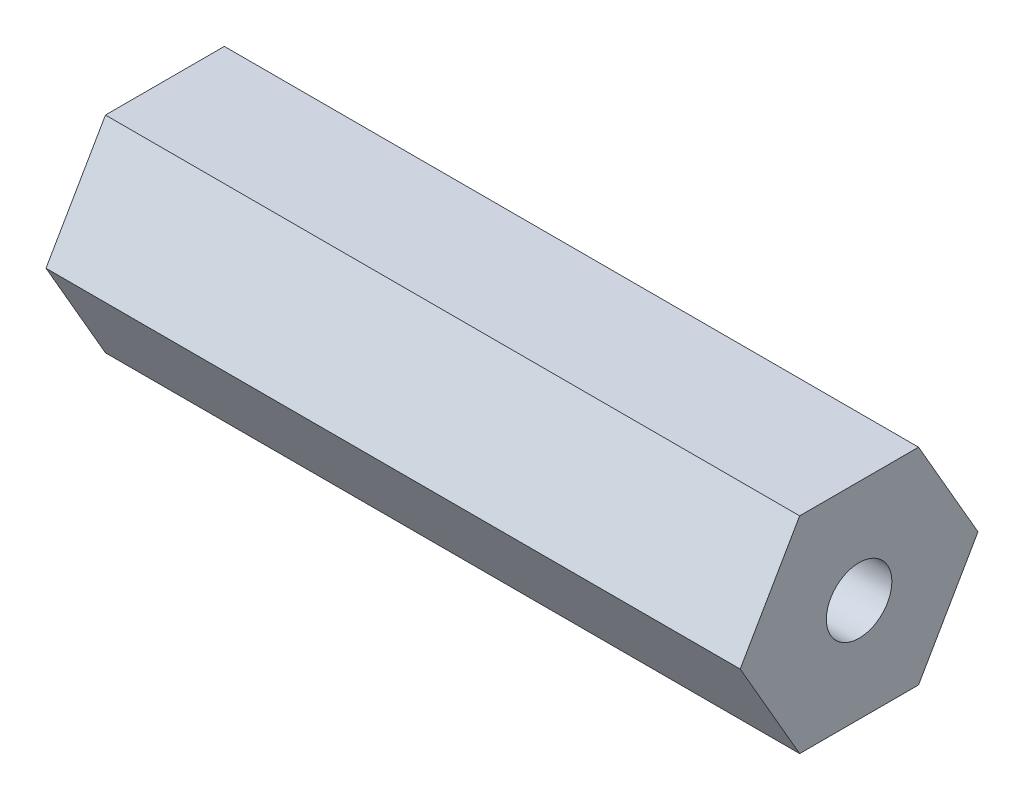
ISO-10303-21;
HEADER;
FILE_DESCRIPTION(('STEP AP214'),'2;1');
FILE_NAME('part.step','',(''),(''),'','','');
FILE_SCHEMA(('AUTOMOTIVE_DESIGN { 1 0 10303 214 1 1 1 1 }'));
ENDSEC;
DATA;
#1=APPLICATION_CONTEXT('core data for automotive mechanical design processes');
#2=APPLICATION_PROTOCOL_DEFINITION('international standard','automotive_design',2000,#1);
#3=PRODUCT_CONTEXT('',#1,'mechanical');
#4=PRODUCT('Part','Part','',(#3));
#5=PRODUCT_RELATED_PRODUCT_CATEGORY('part','',(#4));
#6=PRODUCT_DEFINITION_FORMATION('','',#4);
#7=PRODUCT_DEFINITION_CONTEXT('part definition',#1,'design');
#8=PRODUCT_DEFINITION('design','',#6,#7);
#9=PRODUCT_DEFINITION_SHAPE('','',#8);
#10=(LENGTH_UNIT() NAMED_UNIT(*) SI_UNIT(.MILLI.,.METRE.));
#11=(NAMED_UNIT(*) PLANE_ANGLE_UNIT() SI_UNIT($,.RADIAN.));
#12=(NAMED_UNIT(*) SI_UNIT($,.STERADIAN.) SOLID_ANGLE_UNIT());
#13=UNCERTAINTY_MEASURE_WITH_UNIT(LENGTH_MEASURE(1.E-05),#10,'distance_accuracy_value','');
#14=(GEOMETRIC_REPRESENTATION_CONTEXT(3) GLOBAL_UNCERTAINTY_ASSIGNED_CONTEXT((#13)) GLOBAL_UNIT_ASSIGNED_CONTEXT((#10,
#11,#12)) REPRESENTATION_CONTEXT('',''));
#15=CARTESIAN_POINT('',(0.,0.,0.));
#16=DIRECTION('',(0.,0.,1.));
#17=DIRECTION('',(1.,0.,0.));
#18=AXIS2_PLACEMENT_3D('',#15,#16,#17);
#19=CARTESIAN_POINT('',(42.8117,0.,0.));
#20=DIRECTION('',(1.,0.,0.));
#21=DIRECTION('',(0.,0.,-1.));
#22=AXIS2_PLACEMENT_3D('',#19,#20,#21);
#23=PLANE('',#22);
#24=DIRECTION('',(0.,0.866025403784441,-0.499999999999995));
#25=VECTOR('',#24,1.);
#26=CARTESIAN_POINT('',(42.8117,-6.34999999999993,-3.66617420935418));
#27=LINE('',#26,#25);
#28=CARTESIAN_POINT('',(42.8117,-6.34999999999993,-3.66617420935418));
#29=VERTEX_POINT('',#28);
#30=CARTESIAN_POINT('',(42.8117,0.,-7.33234841870822));
#31=VERTEX_POINT('',#30);
#32=EDGE_CURVE('E129',#29,#31,#27,.T.);
#33=ORIENTED_EDGE('',*,*,#32,.T.);
#34=DIRECTION('',(0.,0.866025403784438,0.500000000000001));
#35=VECTOR('',#34,1.);
#36=CARTESIAN_POINT('',(42.8117,0.,-7.33234841870822));
#37=LINE('',#36,#35);
#38=CARTESIAN_POINT('',(42.8117,6.34999999999999,-3.6661742093541));
#39=VERTEX_POINT('',#38);
#40=EDGE_CURVE('E87',#31,#39,#37,.T.);
#41=ORIENTED_EDGE('',*,*,#40,.T.);
#42=DIRECTION('',(0.,0.,1.));
#43=VECTOR('',#42,1.);
#44=CARTESIAN_POINT('',(42.8117,6.34999999999999,-3.6661742093541));
#45=LINE('',#44,#43);
#46=CARTESIAN_POINT('',(42.8117,6.34999999999996,3.66617420935414));
#47=VERTEX_POINT('',#46);
#48=EDGE_CURVE('E100',#39,#47,#45,.T.);
#49=ORIENTED_EDGE('',*,*,#48,.T.);
#50=DIRECTION('',(0.,-0.866025403784441,0.499999999999995));
#51=VECTOR('',#50,1.);
#52=CARTESIAN_POINT('',(42.8117,6.34999999999996,3.66617420935414));
#53=LINE('',#52,#51);
#54=CARTESIAN_POINT('',(42.8117,0.,7.33234841870822));
#55=VERTEX_POINT('',#54);
#56=EDGE_CURVE('E94',#47,#55,#53,.T.);
#57=ORIENTED_EDGE('',*,*,#56,.T.);
#58=DIRECTION('',(0.,-0.866025403784435,-0.500000000000007));
#59=VECTOR('',#58,1.);
#60=CARTESIAN_POINT('',(42.8117,0.,7.33234841870822));
#61=LINE('',#60,#59);
#62=CARTESIAN_POINT('',(42.8117,-6.35000000000001,3.66617420935405));
#63=VERTEX_POINT('',#62);
#64=EDGE_CURVE('E98',#55,#63,#61,.T.);
#65=ORIENTED_EDGE('',*,*,#64,.T.);
#66=DIRECTION('',(0.,0.,-1.));
#67=VECTOR('',#66,1.);
#68=CARTESIAN_POINT('',(42.8117,-6.35000000000001,3.66617420935405));
#69=LINE('',#68,#67);
#70=EDGE_CURVE('E50',#63,#29,#69,.T.);
#71=ORIENTED_EDGE('',*,*,#70,.T.);
#72=EDGE_LOOP('',(#33,#41,#49,#57,#65,#71));
#73=FACE_BOUND('',#72,.T.);
#74=CARTESIAN_POINT('',(42.8117,0.,0.));
#75=DIRECTION('',(1.,0.,0.));
#76=DIRECTION('',(0.,0.,-1.));
#77=AXIS2_PLACEMENT_3D('',#74,#75,#76);
#78=CIRCLE('',#77,2.0193);
#79=CARTESIAN_POINT('',(42.8117,0.,-2.0193));
#80=VERTEX_POINT('',#79);
#81=EDGE_CURVE('E122',#80,#80,#78,.T.);
#82=ORIENTED_EDGE('',*,*,#81,.F.);
#83=EDGE_LOOP('',(#82));
#84=FACE_BOUND('',#83,.T.);
#85=ADVANCED_FACE('F33',(#73,#84),#23,.T.);
#86=CARTESIAN_POINT('',(0.,0.,0.));
#87=DIRECTION('',(1.,0.,0.));
#88=DIRECTION('',(0.,0.,-1.));
#89=AXIS2_PLACEMENT_3D('',#86,#87,#88);
#90=PLANE('',#89);
#91=DIRECTION('',(0.,0.866025403784441,-0.499999999999995));
#92=VECTOR('',#91,1.);
#93=CARTESIAN_POINT('',(0.,-6.34999999999993,-3.66617420935418));
#94=LINE('',#93,#92);
#95=CARTESIAN_POINT('',(0.,-6.34999999999993,-3.66617420935418));
#96=VERTEX_POINT('',#95);
#97=CARTESIAN_POINT('',(0.,0.,-7.33234841870822));
#98=VERTEX_POINT('',#97);
#99=EDGE_CURVE('E118',#96,#98,#94,.T.);
#100=ORIENTED_EDGE('',*,*,#99,.F.);
#101=DIRECTION('',(0.,0.,-1.));
#102=VECTOR('',#101,1.);
#103=CARTESIAN_POINT('',(0.,-6.35000000000001,3.66617420935405));
#104=LINE('',#103,#102);
#105=CARTESIAN_POINT('',(0.,-6.35000000000001,3.66617420935405));
#106=VERTEX_POINT('',#105);
#107=EDGE_CURVE('E79',#106,#96,#104,.T.);
#108=ORIENTED_EDGE('',*,*,#107,.F.);
#109=DIRECTION('',(0.,-0.866025403784435,-0.500000000000007));
#110=VECTOR('',#109,1.);
#111=CARTESIAN_POINT('',(0.,0.,7.33234841870822));
#112=LINE('',#111,#110);
#113=CARTESIAN_POINT('',(0.,0.,7.33234841870822));
#114=VERTEX_POINT('',#113);
#115=EDGE_CURVE('E73',#114,#106,#112,.T.);
#116=ORIENTED_EDGE('',*,*,#115,.F.);
#117=DIRECTION('',(0.,-0.866025403784441,0.499999999999995));
#118=VECTOR('',#117,1.);
#119=CARTESIAN_POINT('',(0.,6.34999999999996,3.66617420935414));
#120=LINE('',#119,#118);
#121=CARTESIAN_POINT('',(0.,6.34999999999996,3.66617420935414));
#122=VERTEX_POINT('',#121);
#123=EDGE_CURVE('E108',#122,#114,#120,.T.);
#124=ORIENTED_EDGE('',*,*,#123,.F.);
#125=DIRECTION('',(0.,0.,1.));
#126=VECTOR('',#125,1.);
#127=CARTESIAN_POINT('',(0.,6.34999999999999,-3.6661742093541));
#128=LINE('',#127,#126);
#129=CARTESIAN_POINT('',(0.,6.34999999999999,-3.6661742093541));
#130=VERTEX_POINT('',#129);
#131=EDGE_CURVE('E124',#130,#122,#128,.T.);
#132=ORIENTED_EDGE('',*,*,#131,.F.);
#133=DIRECTION('',(0.,0.866025403784438,0.500000000000001));
#134=VECTOR('',#133,1.);
#135=CARTESIAN_POINT('',(0.,0.,-7.33234841870822));
#136=LINE('',#135,#134);
#137=EDGE_CURVE('E121',#98,#130,#136,.T.);
#138=ORIENTED_EDGE('',*,*,#137,.F.);
#139=EDGE_LOOP('',(#100,#108,#116,#124,#132,#138));
#140=FACE_BOUND('',#139,.T.);
#141=CARTESIAN_POINT('',(0.,0.,0.));
#142=DIRECTION('',(1.,0.,0.));
#143=DIRECTION('',(0.,0.,-1.));
#144=AXIS2_PLACEMENT_3D('',#141,#142,#143);
#145=CIRCLE('',#144,2.0193);
#146=CARTESIAN_POINT('',(0.,0.,-2.0193));
#147=VERTEX_POINT('',#146);
#148=EDGE_CURVE('E222',#147,#147,#145,.T.);
#149=ORIENTED_EDGE('',*,*,#148,.T.);
#150=EDGE_LOOP('',(#149));
#151=FACE_BOUND('',#150,.T.);
#152=ADVANCED_FACE('F138',(#140,#151),#90,.F.);
#153=CARTESIAN_POINT('',(42.8117,-6.34999999999993,-3.66617420935418));
#154=DIRECTION('',(0.,0.499999999999995,0.866025403784441));
#155=DIRECTION('',(0.,-0.866025403784441,0.499999999999995));
#156=AXIS2_PLACEMENT_3D('',#153,#154,#155);
#157=PLANE('',#156);
#158=ORIENTED_EDGE('',*,*,#99,.T.);
#159=DIRECTION('',(-1.,0.,0.));
#160=VECTOR('',#159,1.);
#161=CARTESIAN_POINT('',(42.8117,0.,-7.33234841870822));
#162=LINE('',#161,#160);
#163=EDGE_CURVE('E11',#31,#98,#162,.T.);
#164=ORIENTED_EDGE('',*,*,#163,.F.);
#165=ORIENTED_EDGE('',*,*,#32,.F.);
#166=DIRECTION('',(-1.,0.,0.));
#167=VECTOR('',#166,1.);
#168=CARTESIAN_POINT('',(42.8117,-6.34999999999993,-3.66617420935418));
#169=LINE('',#168,#167);
#170=EDGE_CURVE('E114',#29,#96,#169,.T.);
#171=ORIENTED_EDGE('',*,*,#170,.T.);
#172=EDGE_LOOP('',(#158,#164,#165,#171));
#173=FACE_BOUND('',#172,.T.);
#174=ADVANCED_FACE('F35',(#173),#157,.F.);
#175=CARTESIAN_POINT('',(42.8117,0.,-7.33234841870822));
#176=DIRECTION('',(0.,-0.500000000000001,0.866025403784438));
#177=DIRECTION('',(0.,-0.866025403784438,-0.500000000000001));
#178=AXIS2_PLACEMENT_3D('',#175,#176,#177);
#179=PLANE('',#178);
#180=ORIENTED_EDGE('',*,*,#137,.T.);
#181=DIRECTION('',(-1.,0.,0.));
#182=VECTOR('',#181,1.);
#183=CARTESIAN_POINT('',(42.8117,6.34999999999999,-3.6661742093541));
#184=LINE('',#183,#182);
#185=EDGE_CURVE('E42',#39,#130,#184,.T.);
#186=ORIENTED_EDGE('',*,*,#185,.F.);
#187=ORIENTED_EDGE('',*,*,#40,.F.);
#188=ORIENTED_EDGE('',*,*,#163,.T.);
#189=EDGE_LOOP('',(#180,#186,#187,#188));
#190=FACE_BOUND('',#189,.T.);
#191=ADVANCED_FACE('F163',(#190),#179,.F.);
#192=CARTESIAN_POINT('',(42.8117,6.34999999999999,-3.6661742093541));
#193=DIRECTION('',(0.,-1.,0.));
#194=DIRECTION('',(0.,0.,-1.));
#195=AXIS2_PLACEMENT_3D('',#192,#193,#194);
#196=PLANE('',#195);
#197=ORIENTED_EDGE('',*,*,#131,.T.);
#198=DIRECTION('',(-1.,0.,0.));
#199=VECTOR('',#198,1.);
#200=CARTESIAN_POINT('',(42.8117,6.34999999999996,3.66617420935414));
#201=LINE('',#200,#199);
#202=EDGE_CURVE('E109',#47,#122,#201,.T.);
#203=ORIENTED_EDGE('',*,*,#202,.F.);
#204=ORIENTED_EDGE('',*,*,#48,.F.);
#205=ORIENTED_EDGE('',*,*,#185,.T.);
#206=EDGE_LOOP('',(#197,#203,#204,#205));
#207=FACE_BOUND('',#206,.T.);
#208=ADVANCED_FACE('F135',(#207),#196,.F.);
#209=CARTESIAN_POINT('',(42.8117,6.34999999999996,3.66617420935414));
#210=DIRECTION('',(0.,-0.499999999999995,-0.866025403784441));
#211=DIRECTION('',(0.,0.866025403784442,-0.499999999999995));
#212=AXIS2_PLACEMENT_3D('',#209,#210,#211);
#213=PLANE('',#212);
#214=ORIENTED_EDGE('',*,*,#123,.T.);
#215=DIRECTION('',(-1.,0.,0.));
#216=VECTOR('',#215,1.);
#217=CARTESIAN_POINT('',(42.8117,0.,7.33234841870822));
#218=LINE('',#217,#216);
#219=EDGE_CURVE('E105',#55,#114,#218,.T.);
#220=ORIENTED_EDGE('',*,*,#219,.F.);
#221=ORIENTED_EDGE('',*,*,#56,.F.);
#222=ORIENTED_EDGE('',*,*,#202,.T.);
#223=EDGE_LOOP('',(#214,#220,#221,#222));
#224=FACE_BOUND('',#223,.T.);
#225=ADVANCED_FACE('F106',(#224),#213,.F.);
#226=CARTESIAN_POINT('',(42.8117,0.,7.33234841870822));
#227=DIRECTION('',(0.,0.500000000000007,-0.866025403784435));
#228=DIRECTION('',(0.,0.866025403784435,0.500000000000007));
#229=AXIS2_PLACEMENT_3D('',#226,#227,#228);
#230=PLANE('',#229);
#231=ORIENTED_EDGE('',*,*,#115,.T.);
#232=DIRECTION('',(-1.,0.,0.));
#233=VECTOR('',#232,1.);
#234=CARTESIAN_POINT('',(42.8117,-6.35000000000001,3.66617420935405));
#235=LINE('',#234,#233);
#236=EDGE_CURVE('E110',#63,#106,#235,.T.);
#237=ORIENTED_EDGE('',*,*,#236,.F.);
#238=ORIENTED_EDGE('',*,*,#64,.F.);
#239=ORIENTED_EDGE('',*,*,#219,.T.);
#240=EDGE_LOOP('',(#231,#237,#238,#239));
#241=FACE_BOUND('',#240,.T.);
#242=ADVANCED_FACE('F112',(#241),#230,.F.);
#243=CARTESIAN_POINT('',(42.8117,-6.35000000000001,3.66617420935405));
#244=DIRECTION('',(0.,1.,0.));
#245=DIRECTION('',(0.,0.,1.));
#246=AXIS2_PLACEMENT_3D('',#243,#244,#245);
#247=PLANE('',#246);
#248=ORIENTED_EDGE('',*,*,#107,.T.);
#249=ORIENTED_EDGE('',*,*,#170,.F.);
#250=ORIENTED_EDGE('',*,*,#70,.F.);
#251=ORIENTED_EDGE('',*,*,#236,.T.);
#252=EDGE_LOOP('',(#248,#249,#250,#251));
#253=FACE_BOUND('',#252,.T.);
#254=ADVANCED_FACE('F143',(#253),#247,.F.);
#255=CARTESIAN_POINT('',(42.8117,0.,0.));
#256=DIRECTION('',(-1.,0.,0.));
#257=DIRECTION('',(0.,0.,1.));
#258=AXIS2_PLACEMENT_3D('',#255,#256,#257);
#259=CYLINDRICAL_SURFACE('',#258,2.0193);
#260=ORIENTED_EDGE('',*,*,#81,.T.);
#261=EDGE_LOOP('',(#260));
#262=FACE_BOUND('',#261,.T.);
#263=ORIENTED_EDGE('',*,*,#148,.F.);
#264=EDGE_LOOP('',(#263));
#265=FACE_BOUND('',#264,.T.);
#266=ADVANCED_FACE('F145',(#262,#265),#259,.F.);
#267=CLOSED_SHELL('',(#85,#152,#174,#191,#208,#225,#242,#254,#266));
#268=MANIFOLD_SOLID_BREP('B2',#267);
#269=ADVANCED_BREP_SHAPE_REPRESENTATION('',(#18,#268),#14);
#270=SHAPE_DEFINITION_REPRESENTATION(#9,#269);
ENDSEC;
END-ISO-10303-21;
